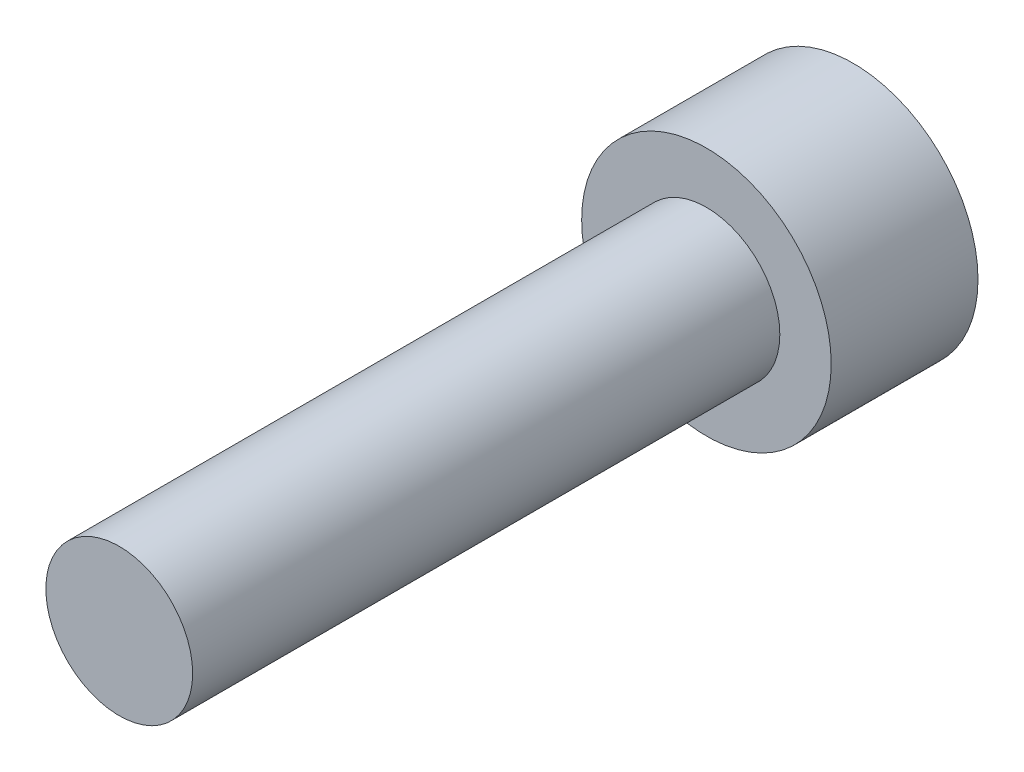
ISO-10303-21;
HEADER;
FILE_DESCRIPTION(('STEP AP214'),'2;1');
FILE_NAME('part.step','',(''),(''),'','','');
FILE_SCHEMA(('AUTOMOTIVE_DESIGN { 1 0 10303 214 1 1 1 1 }'));
ENDSEC;
DATA;
#1=APPLICATION_CONTEXT('core data for automotive mechanical design processes');
#2=APPLICATION_PROTOCOL_DEFINITION('international standard','automotive_design',2000,#1);
#3=PRODUCT_CONTEXT('',#1,'mechanical');
#4=PRODUCT('Part','Part','',(#3));
#5=PRODUCT_RELATED_PRODUCT_CATEGORY('part','',(#4));
#6=PRODUCT_DEFINITION_FORMATION('','',#4);
#7=PRODUCT_DEFINITION_CONTEXT('part definition',#1,'design');
#8=PRODUCT_DEFINITION('design','',#6,#7);
#9=PRODUCT_DEFINITION_SHAPE('','',#8);
#10=(LENGTH_UNIT() NAMED_UNIT(*) SI_UNIT(.MILLI.,.METRE.));
#11=(NAMED_UNIT(*) PLANE_ANGLE_UNIT() SI_UNIT($,.RADIAN.));
#12=(NAMED_UNIT(*) SI_UNIT($,.STERADIAN.) SOLID_ANGLE_UNIT());
#13=UNCERTAINTY_MEASURE_WITH_UNIT(LENGTH_MEASURE(1.E-05),#10,'distance_accuracy_value','');
#14=(GEOMETRIC_REPRESENTATION_CONTEXT(3) GLOBAL_UNCERTAINTY_ASSIGNED_CONTEXT((#13)) GLOBAL_UNIT_ASSIGNED_CONTEXT((#10,
#11,#12)) REPRESENTATION_CONTEXT('',''));
#15=CARTESIAN_POINT('',(0.,0.,0.));
#16=DIRECTION('',(0.,0.,1.));
#17=DIRECTION('',(1.,0.,0.));
#18=AXIS2_PLACEMENT_3D('',#15,#16,#17);
#19=CARTESIAN_POINT('',(0.,0.,0.));
#20=DIRECTION('',(0.,0.,-1.));
#21=DIRECTION('',(-1.,0.,0.));
#22=AXIS2_PLACEMENT_3D('',#19,#20,#21);
#23=CYLINDRICAL_SURFACE('',#22,4.25);
#24=CARTESIAN_POINT('',(0.,0.,0.));
#25=DIRECTION('',(0.,0.,1.));
#26=DIRECTION('',(1.,0.,0.));
#27=AXIS2_PLACEMENT_3D('',#24,#25,#26);
#28=CIRCLE('',#27,4.25);
#29=CARTESIAN_POINT('',(4.25,0.,0.));
#30=VERTEX_POINT('',#29);
#31=EDGE_CURVE('E42',#30,#30,#28,.T.);
#32=ORIENTED_EDGE('',*,*,#31,.F.);
#33=EDGE_LOOP('',(#32));
#34=FACE_BOUND('',#33,.T.);
#35=CARTESIAN_POINT('',(0.,0.,-5.));
#36=DIRECTION('',(0.,0.,1.));
#37=DIRECTION('',(1.,0.,0.));
#38=AXIS2_PLACEMENT_3D('',#35,#36,#37);
#39=CIRCLE('',#38,4.25);
#40=CARTESIAN_POINT('',(4.25,0.,-5.));
#41=VERTEX_POINT('',#40);
#42=EDGE_CURVE('E37',#41,#41,#39,.T.);
#43=ORIENTED_EDGE('',*,*,#42,.T.);
#44=EDGE_LOOP('',(#43));
#45=FACE_BOUND('',#44,.T.);
#46=ADVANCED_FACE('F40',(#34,#45),#23,.T.);
#47=CARTESIAN_POINT('',(0.,0.,0.));
#48=DIRECTION('',(0.,0.,1.));
#49=DIRECTION('',(1.,0.,0.));
#50=AXIS2_PLACEMENT_3D('',#47,#48,#49);
#51=PLANE('',#50);
#52=CARTESIAN_POINT('',(0.,0.,0.));
#53=DIRECTION('',(0.,0.,1.));
#54=DIRECTION('',(1.,0.,0.));
#55=AXIS2_PLACEMENT_3D('',#52,#53,#54);
#56=CIRCLE('',#55,2.5);
#57=CARTESIAN_POINT('',(2.5,0.,0.));
#58=VERTEX_POINT('',#57);
#59=EDGE_CURVE('E10',#58,#58,#56,.T.);
#60=ORIENTED_EDGE('',*,*,#59,.F.);
#61=EDGE_LOOP('',(#60));
#62=FACE_BOUND('',#61,.T.);
#63=ORIENTED_EDGE('',*,*,#31,.T.);
#64=EDGE_LOOP('',(#63));
#65=FACE_BOUND('',#64,.T.);
#66=ADVANCED_FACE('F63',(#62,#65),#51,.T.);
#67=CARTESIAN_POINT('',(0.,0.,-5.));
#68=DIRECTION('',(0.,0.,1.));
#69=DIRECTION('',(1.,0.,0.));
#70=AXIS2_PLACEMENT_3D('',#67,#68,#69);
#71=PLANE('',#70);
#72=ORIENTED_EDGE('',*,*,#42,.F.);
#73=EDGE_LOOP('',(#72));
#74=FACE_BOUND('',#73,.T.);
#75=ADVANCED_FACE('F59',(#74),#71,.F.);
#76=CARTESIAN_POINT('',(0.,0.,20.));
#77=DIRECTION('',(0.,0.,-1.));
#78=DIRECTION('',(-1.,0.,0.));
#79=AXIS2_PLACEMENT_3D('',#76,#77,#78);
#80=CYLINDRICAL_SURFACE('',#79,2.5);
#81=CARTESIAN_POINT('',(0.,0.,20.));
#82=DIRECTION('',(0.,0.,1.));
#83=DIRECTION('',(1.,0.,0.));
#84=AXIS2_PLACEMENT_3D('',#81,#82,#83);
#85=CIRCLE('',#84,2.5);
#86=CARTESIAN_POINT('',(2.5,0.,20.));
#87=VERTEX_POINT('',#86);
#88=EDGE_CURVE('E49',#87,#87,#85,.T.);
#89=ORIENTED_EDGE('',*,*,#88,.F.);
#90=EDGE_LOOP('',(#89));
#91=FACE_BOUND('',#90,.T.);
#92=ORIENTED_EDGE('',*,*,#59,.T.);
#93=EDGE_LOOP('',(#92));
#94=FACE_BOUND('',#93,.T.);
#95=ADVANCED_FACE('F58',(#91,#94),#80,.T.);
#96=CARTESIAN_POINT('',(0.,0.,20.));
#97=DIRECTION('',(0.,0.,1.));
#98=DIRECTION('',(1.,0.,0.));
#99=AXIS2_PLACEMENT_3D('',#96,#97,#98);
#100=PLANE('',#99);
#101=ORIENTED_EDGE('',*,*,#88,.T.);
#102=EDGE_LOOP('',(#101));
#103=FACE_BOUND('',#102,.T.);
#104=ADVANCED_FACE('F70',(#103),#100,.T.);
#105=CLOSED_SHELL('',(#46,#66,#75,#95,#104));
#106=MANIFOLD_SOLID_BREP('B2',#105);
#107=ADVANCED_BREP_SHAPE_REPRESENTATION('',(#18,#106),#14);
#108=SHAPE_DEFINITION_REPRESENTATION(#9,#107);
ENDSEC;
END-ISO-10303-21;
